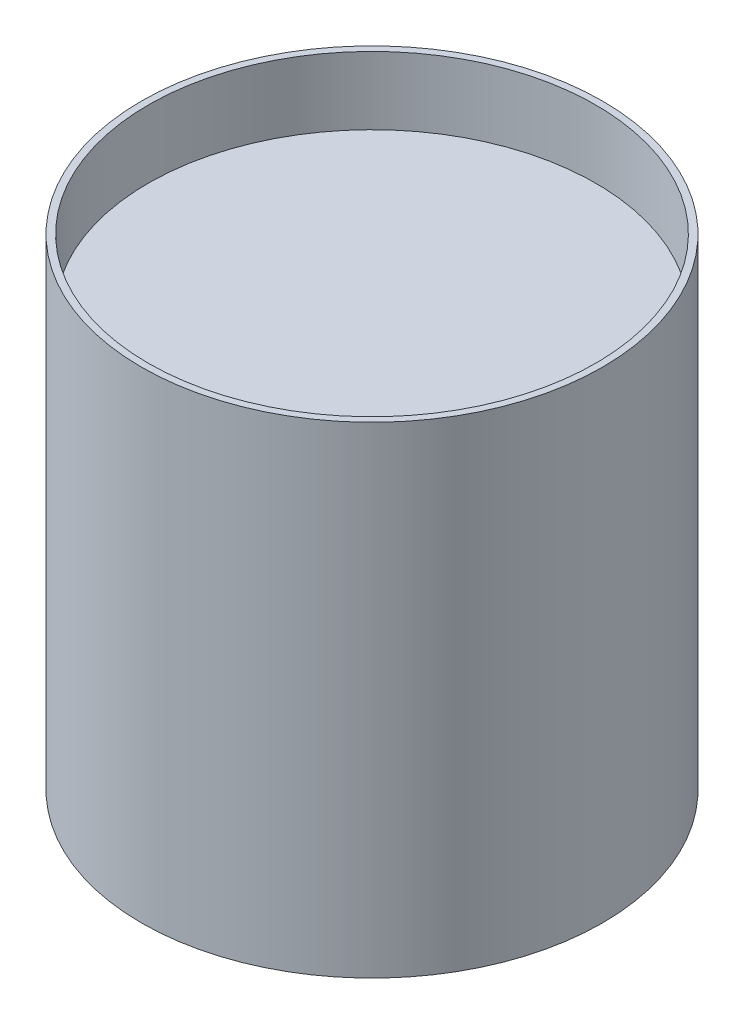
ISO-10303-21;
HEADER;
FILE_DESCRIPTION(('STEP AP214'),'2;1');
FILE_NAME('part.step','',(''),(''),'','','');
FILE_SCHEMA(('AUTOMOTIVE_DESIGN { 1 0 10303 214 1 1 1 1 }'));
ENDSEC;
DATA;
#1=APPLICATION_CONTEXT('core data for automotive mechanical design processes');
#2=APPLICATION_PROTOCOL_DEFINITION('international standard','automotive_design',2000,#1);
#3=PRODUCT_CONTEXT('',#1,'mechanical');
#4=PRODUCT('Part','Part','',(#3));
#5=PRODUCT_RELATED_PRODUCT_CATEGORY('part','',(#4));
#6=PRODUCT_DEFINITION_FORMATION('','',#4);
#7=PRODUCT_DEFINITION_CONTEXT('part definition',#1,'design');
#8=PRODUCT_DEFINITION('design','',#6,#7);
#9=PRODUCT_DEFINITION_SHAPE('','',#8);
#10=(LENGTH_UNIT() NAMED_UNIT(*) SI_UNIT(.MILLI.,.METRE.));
#11=(NAMED_UNIT(*) PLANE_ANGLE_UNIT() SI_UNIT($,.RADIAN.));
#12=(NAMED_UNIT(*) SI_UNIT($,.STERADIAN.) SOLID_ANGLE_UNIT());
#13=UNCERTAINTY_MEASURE_WITH_UNIT(LENGTH_MEASURE(1.E-05),#10,'distance_accuracy_value','');
#14=(GEOMETRIC_REPRESENTATION_CONTEXT(3) GLOBAL_UNCERTAINTY_ASSIGNED_CONTEXT((#13)) GLOBAL_UNIT_ASSIGNED_CONTEXT((#10,
#11,#12)) REPRESENTATION_CONTEXT('',''));
#15=CARTESIAN_POINT('',(0.,0.,0.));
#16=DIRECTION('',(0.,0.,1.));
#17=DIRECTION('',(1.,0.,0.));
#18=AXIS2_PLACEMENT_3D('',#15,#16,#17);
#19=CARTESIAN_POINT('',(0.,71.,0.));
#20=DIRECTION('',(0.,-1.,0.));
#21=DIRECTION('',(0.,0.,-1.));
#22=AXIS2_PLACEMENT_3D('',#19,#20,#21);
#23=CYLINDRICAL_SURFACE('',#22,33.);
#24=CARTESIAN_POINT('',(0.,10.,0.));
#25=DIRECTION('',(0.,-1.,0.));
#26=DIRECTION('',(0.,0.,-1.));
#27=AXIS2_PLACEMENT_3D('',#24,#25,#26);
#28=CIRCLE('',#27,33.);
#29=CARTESIAN_POINT('',(0.,10.,-33.));
#30=VERTEX_POINT('',#29);
#31=EDGE_CURVE('E10',#30,#30,#28,.T.);
#32=ORIENTED_EDGE('',*,*,#31,.F.);
#33=EDGE_LOOP('',(#32));
#34=FACE_BOUND('',#33,.T.);
#35=CARTESIAN_POINT('',(0.,0.,0.));
#36=DIRECTION('',(0.,1.,0.));
#37=DIRECTION('',(0.,0.,1.));
#38=AXIS2_PLACEMENT_3D('',#35,#36,#37);
#39=CIRCLE('',#38,33.);
#40=CARTESIAN_POINT('',(0.,0.,33.));
#41=VERTEX_POINT('',#40);
#42=EDGE_CURVE('E66',#41,#41,#39,.T.);
#43=ORIENTED_EDGE('',*,*,#42,.F.);
#44=EDGE_LOOP('',(#43));
#45=FACE_BOUND('',#44,.T.);
#46=ADVANCED_FACE('F41',(#34,#45),#23,.F.);
#47=CARTESIAN_POINT('',(0.,71.,0.));
#48=DIRECTION('',(0.,1.,0.));
#49=DIRECTION('',(0.,0.,1.));
#50=AXIS2_PLACEMENT_3D('',#47,#48,#49);
#51=PLANE('',#50);
#52=CARTESIAN_POINT('',(0.,71.,0.));
#53=DIRECTION('',(0.,1.,0.));
#54=DIRECTION('',(0.,0.,1.));
#55=AXIS2_PLACEMENT_3D('',#52,#53,#54);
#56=CIRCLE('',#55,34.);
#57=CARTESIAN_POINT('',(0.,71.,34.));
#58=VERTEX_POINT('',#57);
#59=EDGE_CURVE('E54',#58,#58,#56,.T.);
#60=ORIENTED_EDGE('',*,*,#59,.T.);
#61=EDGE_LOOP('',(#60));
#62=FACE_BOUND('',#61,.T.);
#63=CARTESIAN_POINT('',(0.,71.,0.));
#64=DIRECTION('',(0.,1.,0.));
#65=DIRECTION('',(0.,0.,1.));
#66=AXIS2_PLACEMENT_3D('',#63,#64,#65);
#67=CIRCLE('',#66,33.);
#68=CARTESIAN_POINT('',(0.,71.,33.));
#69=VERTEX_POINT('',#68);
#70=EDGE_CURVE('E64',#69,#69,#67,.T.);
#71=ORIENTED_EDGE('',*,*,#70,.F.);
#72=EDGE_LOOP('',(#71));
#73=FACE_BOUND('',#72,.T.);
#74=ADVANCED_FACE('F76',(#62,#73),#51,.T.);
#75=CARTESIAN_POINT('',(0.,0.,0.));
#76=DIRECTION('',(0.,1.,0.));
#77=DIRECTION('',(0.,0.,1.));
#78=AXIS2_PLACEMENT_3D('',#75,#76,#77);
#79=PLANE('',#78);
#80=CARTESIAN_POINT('',(0.,0.,0.));
#81=DIRECTION('',(0.,1.,0.));
#82=DIRECTION('',(0.,0.,1.));
#83=AXIS2_PLACEMENT_3D('',#80,#81,#82);
#84=CIRCLE('',#83,34.);
#85=CARTESIAN_POINT('',(0.,0.,34.));
#86=VERTEX_POINT('',#85);
#87=EDGE_CURVE('E59',#86,#86,#84,.T.);
#88=ORIENTED_EDGE('',*,*,#87,.F.);
#89=EDGE_LOOP('',(#88));
#90=FACE_BOUND('',#89,.T.);
#91=ORIENTED_EDGE('',*,*,#42,.T.);
#92=EDGE_LOOP('',(#91));
#93=FACE_BOUND('',#92,.T.);
#94=ADVANCED_FACE('F78',(#90,#93),#79,.F.);
#95=CARTESIAN_POINT('',(0.,71.,0.));
#96=DIRECTION('',(0.,-1.,0.));
#97=DIRECTION('',(0.,0.,-1.));
#98=AXIS2_PLACEMENT_3D('',#95,#96,#97);
#99=CYLINDRICAL_SURFACE('',#98,34.);
#100=ORIENTED_EDGE('',*,*,#59,.F.);
#101=EDGE_LOOP('',(#100));
#102=FACE_BOUND('',#101,.T.);
#103=ORIENTED_EDGE('',*,*,#87,.T.);
#104=EDGE_LOOP('',(#103));
#105=FACE_BOUND('',#104,.T.);
#106=ADVANCED_FACE('F43',(#102,#105),#99,.T.);
#107=CARTESIAN_POINT('',(0.,61.,0.));
#108=DIRECTION('',(0.,1.,0.));
#109=DIRECTION('',(0.,0.,1.));
#110=AXIS2_PLACEMENT_3D('',#107,#108,#109);
#111=CIRCLE('',#110,33.);
#112=CARTESIAN_POINT('',(0.,61.,33.));
#113=VERTEX_POINT('',#112);
#114=EDGE_CURVE('E49',#113,#113,#111,.T.);
#115=ORIENTED_EDGE('',*,*,#114,.F.);
#116=EDGE_LOOP('',(#115));
#117=FACE_BOUND('',#116,.T.);
#118=ORIENTED_EDGE('',*,*,#70,.T.);
#119=EDGE_LOOP('',(#118));
#120=FACE_BOUND('',#119,.T.);
#121=ADVANCED_FACE('F74',(#117,#120),#23,.F.);
#122=CARTESIAN_POINT('',(-33.,61.,0.));
#123=DIRECTION('',(0.,1.,0.));
#124=DIRECTION('',(0.,0.,1.));
#125=AXIS2_PLACEMENT_3D('',#122,#123,#124);
#126=PLANE('',#125);
#127=ORIENTED_EDGE('',*,*,#114,.T.);
#128=EDGE_LOOP('',(#127));
#129=FACE_BOUND('',#128,.T.);
#130=ADVANCED_FACE('F90',(#129),#126,.T.);
#131=CARTESIAN_POINT('',(-33.,10.,0.));
#132=DIRECTION('',(0.,-1.,0.));
#133=DIRECTION('',(0.,0.,-1.));
#134=AXIS2_PLACEMENT_3D('',#131,#132,#133);
#135=PLANE('',#134);
#136=ORIENTED_EDGE('',*,*,#31,.T.);
#137=EDGE_LOOP('',(#136));
#138=FACE_BOUND('',#137,.T.);
#139=ADVANCED_FACE('F92',(#138),#135,.T.);
#140=CLOSED_SHELL('',(#46,#74,#94,#106,#121,#130,#139));
#141=MANIFOLD_SOLID_BREP('B2',#140);
#142=ADVANCED_BREP_SHAPE_REPRESENTATION('',(#18,#141),#14);
#143=SHAPE_DEFINITION_REPRESENTATION(#9,#142);
ENDSEC;
END-ISO-10303-21;
